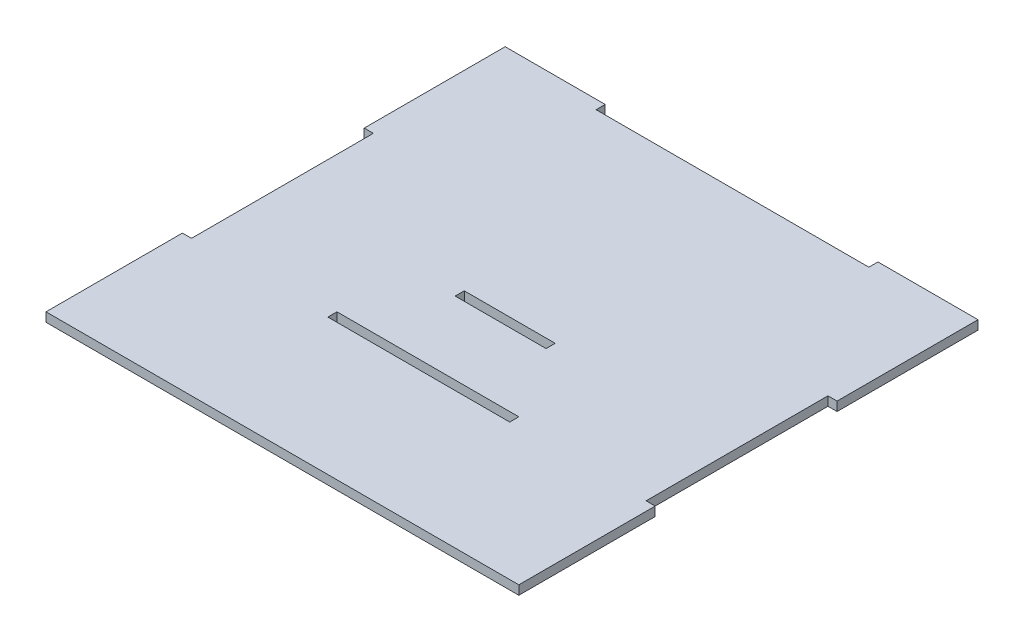
ISO-10303-21;
HEADER;
FILE_DESCRIPTION(('STEP AP214'),'2;1');
FILE_NAME('part.step','',(''),(''),'','','');
FILE_SCHEMA(('AUTOMOTIVE_DESIGN { 1 0 10303 214 1 1 1 1 }'));
ENDSEC;
DATA;
#1=APPLICATION_CONTEXT('core data for automotive mechanical design processes');
#2=APPLICATION_PROTOCOL_DEFINITION('international standard','automotive_design',2000,#1);
#3=PRODUCT_CONTEXT('',#1,'mechanical');
#4=PRODUCT('Part','Part','',(#3));
#5=PRODUCT_RELATED_PRODUCT_CATEGORY('part','',(#4));
#6=PRODUCT_DEFINITION_FORMATION('','',#4);
#7=PRODUCT_DEFINITION_CONTEXT('part definition',#1,'design');
#8=PRODUCT_DEFINITION('design','',#6,#7);
#9=PRODUCT_DEFINITION_SHAPE('','',#8);
#10=(LENGTH_UNIT() NAMED_UNIT(*) SI_UNIT(.MILLI.,.METRE.));
#11=(NAMED_UNIT(*) PLANE_ANGLE_UNIT() SI_UNIT($,.RADIAN.));
#12=(NAMED_UNIT(*) SI_UNIT($,.STERADIAN.) SOLID_ANGLE_UNIT());
#13=UNCERTAINTY_MEASURE_WITH_UNIT(LENGTH_MEASURE(1.E-05),#10,'distance_accuracy_value','');
#14=(GEOMETRIC_REPRESENTATION_CONTEXT(3) GLOBAL_UNCERTAINTY_ASSIGNED_CONTEXT((#13)) GLOBAL_UNIT_ASSIGNED_CONTEXT((#10,
#11,#12)) REPRESENTATION_CONTEXT('',''));
#15=CARTESIAN_POINT('',(0.,0.,0.));
#16=DIRECTION('',(0.,0.,1.));
#17=DIRECTION('',(1.,0.,0.));
#18=AXIS2_PLACEMENT_3D('',#15,#16,#17);
#19=CARTESIAN_POINT('',(0.,2.,-101.));
#20=DIRECTION('',(0.,0.,-1.));
#21=DIRECTION('',(-1.,0.,0.));
#22=AXIS2_PLACEMENT_3D('',#19,#20,#21);
#23=PLANE('',#22);
#24=DIRECTION('',(1.,0.,0.));
#25=VECTOR('',#24,1.);
#26=CARTESIAN_POINT('',(0.,0.,-101.));
#27=LINE('',#26,#25);
#28=CARTESIAN_POINT('',(82.,0.,-101.));
#29=VERTEX_POINT('',#28);
#30=CARTESIAN_POINT('',(104.,0.,-101.));
#31=VERTEX_POINT('',#30);
#32=EDGE_CURVE('E279',#29,#31,#27,.T.);
#33=ORIENTED_EDGE('',*,*,#32,.F.);
#34=DIRECTION('',(0.,-1.,0.));
#35=VECTOR('',#34,1.);
#36=CARTESIAN_POINT('',(82.,2.,-101.));
#37=LINE('',#36,#35);
#38=CARTESIAN_POINT('',(82.,2.,-101.));
#39=VERTEX_POINT('',#38);
#40=EDGE_CURVE('E11',#39,#29,#37,.T.);
#41=ORIENTED_EDGE('',*,*,#40,.F.);
#42=DIRECTION('',(1.,0.,0.));
#43=VECTOR('',#42,1.);
#44=CARTESIAN_POINT('',(0.,2.,-101.));
#45=LINE('',#44,#43);
#46=CARTESIAN_POINT('',(104.,2.,-101.));
#47=VERTEX_POINT('',#46);
#48=EDGE_CURVE('E434',#39,#47,#45,.T.);
#49=ORIENTED_EDGE('',*,*,#48,.T.);
#50=DIRECTION('',(0.,-1.,0.));
#51=VECTOR('',#50,1.);
#52=CARTESIAN_POINT('',(104.,2.,-101.));
#53=LINE('',#52,#51);
#54=EDGE_CURVE('E148',#47,#31,#53,.T.);
#55=ORIENTED_EDGE('',*,*,#54,.T.);
#56=EDGE_LOOP('',(#33,#41,#49,#55));
#57=FACE_BOUND('',#56,.T.);
#58=ADVANCED_FACE('F45',(#57),#23,.T.);
#59=CARTESIAN_POINT('',(82.,2.,0.));
#60=DIRECTION('',(1.,0.,0.));
#61=DIRECTION('',(0.,0.,-1.));
#62=AXIS2_PLACEMENT_3D('',#59,#60,#61);
#63=PLANE('',#62);
#64=DIRECTION('',(0.,0.,1.));
#65=VECTOR('',#64,1.);
#66=CARTESIAN_POINT('',(82.,0.,0.));
#67=LINE('',#66,#65);
#68=CARTESIAN_POINT('',(82.,0.,-99.));
#69=VERTEX_POINT('',#68);
#70=EDGE_CURVE('E282',#29,#69,#67,.T.);
#71=ORIENTED_EDGE('',*,*,#70,.T.);
#72=DIRECTION('',(0.,-1.,0.));
#73=VECTOR('',#72,1.);
#74=CARTESIAN_POINT('',(82.,2.,-99.));
#75=LINE('',#74,#73);
#76=CARTESIAN_POINT('',(82.,2.,-99.));
#77=VERTEX_POINT('',#76);
#78=EDGE_CURVE('E56',#77,#69,#75,.T.);
#79=ORIENTED_EDGE('',*,*,#78,.F.);
#80=DIRECTION('',(0.,0.,1.));
#81=VECTOR('',#80,1.);
#82=CARTESIAN_POINT('',(82.,2.,0.));
#83=LINE('',#82,#81);
#84=EDGE_CURVE('E437',#39,#77,#83,.T.);
#85=ORIENTED_EDGE('',*,*,#84,.F.);
#86=ORIENTED_EDGE('',*,*,#40,.T.);
#87=EDGE_LOOP('',(#71,#79,#85,#86));
#88=FACE_BOUND('',#87,.T.);
#89=ADVANCED_FACE('F489',(#88),#63,.F.);
#90=CARTESIAN_POINT('',(0.,2.,-99.));
#91=DIRECTION('',(0.,0.,-1.));
#92=DIRECTION('',(-1.,0.,0.));
#93=AXIS2_PLACEMENT_3D('',#90,#91,#92);
#94=PLANE('',#93);
#95=DIRECTION('',(1.,0.,0.));
#96=VECTOR('',#95,1.);
#97=CARTESIAN_POINT('',(0.,0.,-99.));
#98=LINE('',#97,#96);
#99=CARTESIAN_POINT('',(22.,0.,-99.));
#100=VERTEX_POINT('',#99);
#101=EDGE_CURVE('E287',#100,#69,#98,.T.);
#102=ORIENTED_EDGE('',*,*,#101,.F.);
#103=DIRECTION('',(0.,-1.,0.));
#104=VECTOR('',#103,1.);
#105=CARTESIAN_POINT('',(22.,2.,-99.));
#106=LINE('',#105,#104);
#107=CARTESIAN_POINT('',(22.,2.,-99.));
#108=VERTEX_POINT('',#107);
#109=EDGE_CURVE('E365',#108,#100,#106,.T.);
#110=ORIENTED_EDGE('',*,*,#109,.F.);
#111=DIRECTION('',(1.,0.,0.));
#112=VECTOR('',#111,1.);
#113=CARTESIAN_POINT('',(0.,2.,-99.));
#114=LINE('',#113,#112);
#115=EDGE_CURVE('E441',#108,#77,#114,.T.);
#116=ORIENTED_EDGE('',*,*,#115,.T.);
#117=ORIENTED_EDGE('',*,*,#78,.T.);
#118=EDGE_LOOP('',(#102,#110,#116,#117));
#119=FACE_BOUND('',#118,.T.);
#120=ADVANCED_FACE('F495',(#119),#94,.T.);
#121=CARTESIAN_POINT('',(22.,2.,0.));
#122=DIRECTION('',(1.,0.,0.));
#123=DIRECTION('',(0.,0.,-1.));
#124=AXIS2_PLACEMENT_3D('',#121,#122,#123);
#125=PLANE('',#124);
#126=DIRECTION('',(0.,0.,1.));
#127=VECTOR('',#126,1.);
#128=CARTESIAN_POINT('',(22.,0.,0.));
#129=LINE('',#128,#127);
#130=CARTESIAN_POINT('',(22.,0.,-101.));
#131=VERTEX_POINT('',#130);
#132=EDGE_CURVE('E291',#131,#100,#129,.T.);
#133=ORIENTED_EDGE('',*,*,#132,.F.);
#134=DIRECTION('',(0.,-1.,0.));
#135=VECTOR('',#134,1.);
#136=CARTESIAN_POINT('',(22.,2.,-101.));
#137=LINE('',#136,#135);
#138=CARTESIAN_POINT('',(22.,2.,-101.));
#139=VERTEX_POINT('',#138);
#140=EDGE_CURVE('E362',#139,#131,#137,.T.);
#141=ORIENTED_EDGE('',*,*,#140,.F.);
#142=DIRECTION('',(0.,0.,1.));
#143=VECTOR('',#142,1.);
#144=CARTESIAN_POINT('',(22.,2.,0.));
#145=LINE('',#144,#143);
#146=EDGE_CURVE('E445',#139,#108,#145,.T.);
#147=ORIENTED_EDGE('',*,*,#146,.T.);
#148=ORIENTED_EDGE('',*,*,#109,.T.);
#149=EDGE_LOOP('',(#133,#141,#147,#148));
#150=FACE_BOUND('',#149,.T.);
#151=ADVANCED_FACE('F502',(#150),#125,.T.);
#152=CARTESIAN_POINT('',(0.,0.,-101.));
#153=VERTEX_POINT('',#152);
#154=EDGE_CURVE('E283',#153,#131,#27,.T.);
#155=ORIENTED_EDGE('',*,*,#154,.F.);
#156=DIRECTION('',(0.,-1.,0.));
#157=VECTOR('',#156,1.);
#158=CARTESIAN_POINT('',(0.,2.,-101.));
#159=LINE('',#158,#157);
#160=CARTESIAN_POINT('',(0.,2.,-101.));
#161=VERTEX_POINT('',#160);
#162=EDGE_CURVE('E359',#161,#153,#159,.T.);
#163=ORIENTED_EDGE('',*,*,#162,.F.);
#164=EDGE_CURVE('E438',#161,#139,#45,.T.);
#165=ORIENTED_EDGE('',*,*,#164,.T.);
#166=ORIENTED_EDGE('',*,*,#140,.T.);
#167=EDGE_LOOP('',(#155,#163,#165,#166));
#168=FACE_BOUND('',#167,.T.);
#169=ADVANCED_FACE('F491',(#168),#23,.T.);
#170=CARTESIAN_POINT('',(0.,2.,0.));
#171=DIRECTION('',(-1.,0.,0.));
#172=DIRECTION('',(0.,0.,1.));
#173=AXIS2_PLACEMENT_3D('',#170,#171,#172);
#174=PLANE('',#173);
#175=DIRECTION('',(0.,0.,-1.));
#176=VECTOR('',#175,1.);
#177=CARTESIAN_POINT('',(0.,0.,0.));
#178=LINE('',#177,#176);
#179=CARTESIAN_POINT('',(0.,0.,-70.));
#180=VERTEX_POINT('',#179);
#181=EDGE_CURVE('E295',#180,#153,#178,.T.);
#182=ORIENTED_EDGE('',*,*,#181,.F.);
#183=DIRECTION('',(0.,-1.,0.));
#184=VECTOR('',#183,1.);
#185=CARTESIAN_POINT('',(0.,2.,-70.));
#186=LINE('',#185,#184);
#187=CARTESIAN_POINT('',(0.,2.,-70.));
#188=VERTEX_POINT('',#187);
#189=EDGE_CURVE('E356',#188,#180,#186,.T.);
#190=ORIENTED_EDGE('',*,*,#189,.F.);
#191=DIRECTION('',(0.,0.,-1.));
#192=VECTOR('',#191,1.);
#193=CARTESIAN_POINT('',(0.,2.,0.));
#194=LINE('',#193,#192);
#195=EDGE_CURVE('E449',#188,#161,#194,.T.);
#196=ORIENTED_EDGE('',*,*,#195,.T.);
#197=ORIENTED_EDGE('',*,*,#162,.T.);
#198=EDGE_LOOP('',(#182,#190,#196,#197));
#199=FACE_BOUND('',#198,.T.);
#200=ADVANCED_FACE('F501',(#199),#174,.T.);
#201=CARTESIAN_POINT('',(0.,2.,-70.));
#202=DIRECTION('',(0.,0.,-1.));
#203=DIRECTION('',(-1.,0.,0.));
#204=AXIS2_PLACEMENT_3D('',#201,#202,#203);
#205=PLANE('',#204);
#206=DIRECTION('',(1.,0.,0.));
#207=VECTOR('',#206,1.);
#208=CARTESIAN_POINT('',(0.,0.,-70.));
#209=LINE('',#208,#207);
#210=CARTESIAN_POINT('',(2.,0.,-70.));
#211=VERTEX_POINT('',#210);
#212=EDGE_CURVE('E299',#180,#211,#209,.T.);
#213=ORIENTED_EDGE('',*,*,#212,.T.);
#214=DIRECTION('',(0.,-1.,0.));
#215=VECTOR('',#214,1.);
#216=CARTESIAN_POINT('',(2.,2.,-70.));
#217=LINE('',#216,#215);
#218=CARTESIAN_POINT('',(2.,2.,-70.));
#219=VERTEX_POINT('',#218);
#220=EDGE_CURVE('E352',#219,#211,#217,.T.);
#221=ORIENTED_EDGE('',*,*,#220,.F.);
#222=DIRECTION('',(1.,0.,0.));
#223=VECTOR('',#222,1.);
#224=CARTESIAN_POINT('',(0.,2.,-70.));
#225=LINE('',#224,#223);
#226=EDGE_CURVE('E453',#188,#219,#225,.T.);
#227=ORIENTED_EDGE('',*,*,#226,.F.);
#228=ORIENTED_EDGE('',*,*,#189,.T.);
#229=EDGE_LOOP('',(#213,#221,#227,#228));
#230=FACE_BOUND('',#229,.T.);
#231=ADVANCED_FACE('F508',(#230),#205,.F.);
#232=CARTESIAN_POINT('',(2.,2.,0.));
#233=DIRECTION('',(1.,0.,0.));
#234=DIRECTION('',(0.,0.,-1.));
#235=AXIS2_PLACEMENT_3D('',#232,#233,#234);
#236=PLANE('',#235);
#237=DIRECTION('',(0.,0.,1.));
#238=VECTOR('',#237,1.);
#239=CARTESIAN_POINT('',(2.,0.,0.));
#240=LINE('',#239,#238);
#241=CARTESIAN_POINT('',(2.,0.,-30.));
#242=VERTEX_POINT('',#241);
#243=EDGE_CURVE('E304',#211,#242,#240,.T.);
#244=ORIENTED_EDGE('',*,*,#243,.T.);
#245=DIRECTION('',(0.,-1.,0.));
#246=VECTOR('',#245,1.);
#247=CARTESIAN_POINT('',(2.,2.,-30.));
#248=LINE('',#247,#246);
#249=CARTESIAN_POINT('',(2.,2.,-30.));
#250=VERTEX_POINT('',#249);
#251=EDGE_CURVE('E349',#250,#242,#248,.T.);
#252=ORIENTED_EDGE('',*,*,#251,.F.);
#253=DIRECTION('',(0.,0.,1.));
#254=VECTOR('',#253,1.);
#255=CARTESIAN_POINT('',(2.,2.,0.));
#256=LINE('',#255,#254);
#257=EDGE_CURVE('E458',#219,#250,#256,.T.);
#258=ORIENTED_EDGE('',*,*,#257,.F.);
#259=ORIENTED_EDGE('',*,*,#220,.T.);
#260=EDGE_LOOP('',(#244,#252,#258,#259));
#261=FACE_BOUND('',#260,.T.);
#262=ADVANCED_FACE('F621',(#261),#236,.F.);
#263=CARTESIAN_POINT('',(0.,2.,-30.));
#264=DIRECTION('',(0.,0.,-1.));
#265=DIRECTION('',(-1.,0.,0.));
#266=AXIS2_PLACEMENT_3D('',#263,#264,#265);
#267=PLANE('',#266);
#268=DIRECTION('',(1.,0.,0.));
#269=VECTOR('',#268,1.);
#270=CARTESIAN_POINT('',(0.,0.,-30.));
#271=LINE('',#270,#269);
#272=CARTESIAN_POINT('',(0.,0.,-30.));
#273=VERTEX_POINT('',#272);
#274=EDGE_CURVE('E308',#273,#242,#271,.T.);
#275=ORIENTED_EDGE('',*,*,#274,.F.);
#276=DIRECTION('',(0.,-1.,0.));
#277=VECTOR('',#276,1.);
#278=CARTESIAN_POINT('',(0.,2.,-30.));
#279=LINE('',#278,#277);
#280=CARTESIAN_POINT('',(0.,2.,-30.));
#281=VERTEX_POINT('',#280);
#282=EDGE_CURVE('E346',#281,#273,#279,.T.);
#283=ORIENTED_EDGE('',*,*,#282,.F.);
#284=DIRECTION('',(1.,0.,0.));
#285=VECTOR('',#284,1.);
#286=CARTESIAN_POINT('',(0.,2.,-30.));
#287=LINE('',#286,#285);
#288=EDGE_CURVE('E461',#281,#250,#287,.T.);
#289=ORIENTED_EDGE('',*,*,#288,.T.);
#290=ORIENTED_EDGE('',*,*,#251,.T.);
#291=EDGE_LOOP('',(#275,#283,#289,#290));
#292=FACE_BOUND('',#291,.T.);
#293=ADVANCED_FACE('F535',(#292),#267,.T.);
#294=CARTESIAN_POINT('',(0.,0.,0.));
#295=VERTEX_POINT('',#294);
#296=EDGE_CURVE('E300',#295,#273,#178,.T.);
#297=ORIENTED_EDGE('',*,*,#296,.F.);
#298=DIRECTION('',(0.,-1.,0.));
#299=VECTOR('',#298,1.);
#300=CARTESIAN_POINT('',(0.,2.,0.));
#301=LINE('',#300,#299);
#302=CARTESIAN_POINT('',(0.,2.,0.));
#303=VERTEX_POINT('',#302);
#304=EDGE_CURVE('E343',#303,#295,#301,.T.);
#305=ORIENTED_EDGE('',*,*,#304,.F.);
#306=EDGE_CURVE('E454',#303,#281,#194,.T.);
#307=ORIENTED_EDGE('',*,*,#306,.T.);
#308=ORIENTED_EDGE('',*,*,#282,.T.);
#309=EDGE_LOOP('',(#297,#305,#307,#308));
#310=FACE_BOUND('',#309,.T.);
#311=ADVANCED_FACE('F511',(#310),#174,.T.);
#312=CARTESIAN_POINT('',(0.,2.,0.));
#313=DIRECTION('',(0.,0.,-1.));
#314=DIRECTION('',(-1.,0.,0.));
#315=AXIS2_PLACEMENT_3D('',#312,#313,#314);
#316=PLANE('',#315);
#317=DIRECTION('',(1.,0.,0.));
#318=VECTOR('',#317,1.);
#319=CARTESIAN_POINT('',(0.,0.,0.));
#320=LINE('',#319,#318);
#321=CARTESIAN_POINT('',(104.,0.,0.));
#322=VERTEX_POINT('',#321);
#323=EDGE_CURVE('E312',#295,#322,#320,.T.);
#324=ORIENTED_EDGE('',*,*,#323,.T.);
#325=DIRECTION('',(0.,-1.,0.));
#326=VECTOR('',#325,1.);
#327=CARTESIAN_POINT('',(104.,2.,0.));
#328=LINE('',#327,#326);
#329=CARTESIAN_POINT('',(104.,2.,0.));
#330=VERTEX_POINT('',#329);
#331=EDGE_CURVE('E339',#330,#322,#328,.T.);
#332=ORIENTED_EDGE('',*,*,#331,.F.);
#333=DIRECTION('',(1.,0.,0.));
#334=VECTOR('',#333,1.);
#335=CARTESIAN_POINT('',(0.,2.,0.));
#336=LINE('',#335,#334);
#337=EDGE_CURVE('E465',#303,#330,#336,.T.);
#338=ORIENTED_EDGE('',*,*,#337,.F.);
#339=ORIENTED_EDGE('',*,*,#304,.T.);
#340=EDGE_LOOP('',(#324,#332,#338,#339));
#341=FACE_BOUND('',#340,.T.);
#342=ADVANCED_FACE('F650',(#341),#316,.F.);
#343=CARTESIAN_POINT('',(104.,2.,0.));
#344=DIRECTION('',(-1.,0.,0.));
#345=DIRECTION('',(0.,0.,1.));
#346=AXIS2_PLACEMENT_3D('',#343,#344,#345);
#347=PLANE('',#346);
#348=DIRECTION('',(0.,0.,-1.));
#349=VECTOR('',#348,1.);
#350=CARTESIAN_POINT('',(104.,0.,0.));
#351=LINE('',#350,#349);
#352=CARTESIAN_POINT('',(104.,0.,-30.));
#353=VERTEX_POINT('',#352);
#354=EDGE_CURVE('E316',#322,#353,#351,.T.);
#355=ORIENTED_EDGE('',*,*,#354,.T.);
#356=DIRECTION('',(0.,-1.,0.));
#357=VECTOR('',#356,1.);
#358=CARTESIAN_POINT('',(104.,2.,-30.));
#359=LINE('',#358,#357);
#360=CARTESIAN_POINT('',(104.,2.,-30.));
#361=VERTEX_POINT('',#360);
#362=EDGE_CURVE('E336',#361,#353,#359,.T.);
#363=ORIENTED_EDGE('',*,*,#362,.F.);
#364=DIRECTION('',(0.,0.,-1.));
#365=VECTOR('',#364,1.);
#366=CARTESIAN_POINT('',(104.,2.,0.));
#367=LINE('',#366,#365);
#368=EDGE_CURVE('E244',#330,#361,#367,.T.);
#369=ORIENTED_EDGE('',*,*,#368,.F.);
#370=ORIENTED_EDGE('',*,*,#331,.T.);
#371=EDGE_LOOP('',(#355,#363,#369,#370));
#372=FACE_BOUND('',#371,.T.);
#373=ADVANCED_FACE('F475',(#372),#347,.F.);
#374=CARTESIAN_POINT('',(0.,2.,-30.));
#375=DIRECTION('',(0.,0.,-1.));
#376=DIRECTION('',(-1.,0.,0.));
#377=AXIS2_PLACEMENT_3D('',#374,#375,#376);
#378=PLANE('',#377);
#379=DIRECTION('',(1.,0.,0.));
#380=VECTOR('',#379,1.);
#381=CARTESIAN_POINT('',(0.,0.,-30.));
#382=LINE('',#381,#380);
#383=CARTESIAN_POINT('',(102.,0.,-30.));
#384=VERTEX_POINT('',#383);
#385=EDGE_CURVE('E320',#384,#353,#382,.T.);
#386=ORIENTED_EDGE('',*,*,#385,.F.);
#387=DIRECTION('',(0.,-1.,0.));
#388=VECTOR('',#387,1.);
#389=CARTESIAN_POINT('',(102.,2.,-30.));
#390=LINE('',#389,#388);
#391=CARTESIAN_POINT('',(102.,2.,-30.));
#392=VERTEX_POINT('',#391);
#393=EDGE_CURVE('E229',#392,#384,#390,.T.);
#394=ORIENTED_EDGE('',*,*,#393,.F.);
#395=DIRECTION('',(1.,0.,0.));
#396=VECTOR('',#395,1.);
#397=CARTESIAN_POINT('',(0.,2.,-30.));
#398=LINE('',#397,#396);
#399=EDGE_CURVE('E240',#392,#361,#398,.T.);
#400=ORIENTED_EDGE('',*,*,#399,.T.);
#401=ORIENTED_EDGE('',*,*,#362,.T.);
#402=EDGE_LOOP('',(#386,#394,#400,#401));
#403=FACE_BOUND('',#402,.T.);
#404=ADVANCED_FACE('F478',(#403),#378,.T.);
#405=CARTESIAN_POINT('',(102.,2.,0.));
#406=DIRECTION('',(1.,0.,0.));
#407=DIRECTION('',(0.,0.,-1.));
#408=AXIS2_PLACEMENT_3D('',#405,#406,#407);
#409=PLANE('',#408);
#410=DIRECTION('',(0.,0.,1.));
#411=VECTOR('',#410,1.);
#412=CARTESIAN_POINT('',(102.,0.,0.));
#413=LINE('',#412,#411);
#414=CARTESIAN_POINT('',(102.,0.,-70.));
#415=VERTEX_POINT('',#414);
#416=EDGE_CURVE('E225',#415,#384,#413,.T.);
#417=ORIENTED_EDGE('',*,*,#416,.F.);
#418=DIRECTION('',(0.,-1.,0.));
#419=VECTOR('',#418,1.);
#420=CARTESIAN_POINT('',(102.,2.,-70.));
#421=LINE('',#420,#419);
#422=CARTESIAN_POINT('',(102.,2.,-70.));
#423=VERTEX_POINT('',#422);
#424=EDGE_CURVE('E219',#423,#415,#421,.T.);
#425=ORIENTED_EDGE('',*,*,#424,.F.);
#426=DIRECTION('',(0.,0.,1.));
#427=VECTOR('',#426,1.);
#428=CARTESIAN_POINT('',(102.,2.,0.));
#429=LINE('',#428,#427);
#430=EDGE_CURVE('E223',#423,#392,#429,.T.);
#431=ORIENTED_EDGE('',*,*,#430,.T.);
#432=ORIENTED_EDGE('',*,*,#393,.T.);
#433=EDGE_LOOP('',(#417,#425,#431,#432));
#434=FACE_BOUND('',#433,.T.);
#435=ADVANCED_FACE('F221',(#434),#409,.T.);
#436=CARTESIAN_POINT('',(0.,2.,-70.));
#437=DIRECTION('',(0.,0.,-1.));
#438=DIRECTION('',(-1.,0.,0.));
#439=AXIS2_PLACEMENT_3D('',#436,#437,#438);
#440=PLANE('',#439);
#441=DIRECTION('',(1.,0.,0.));
#442=VECTOR('',#441,1.);
#443=CARTESIAN_POINT('',(0.,0.,-70.));
#444=LINE('',#443,#442);
#445=CARTESIAN_POINT('',(104.,0.,-70.));
#446=VERTEX_POINT('',#445);
#447=EDGE_CURVE('E326',#415,#446,#444,.T.);
#448=ORIENTED_EDGE('',*,*,#447,.T.);
#449=DIRECTION('',(0.,-1.,0.));
#450=VECTOR('',#449,1.);
#451=CARTESIAN_POINT('',(104.,2.,-70.));
#452=LINE('',#451,#450);
#453=CARTESIAN_POINT('',(104.,2.,-70.));
#454=VERTEX_POINT('',#453);
#455=EDGE_CURVE('E230',#454,#446,#452,.T.);
#456=ORIENTED_EDGE('',*,*,#455,.F.);
#457=DIRECTION('',(1.,0.,0.));
#458=VECTOR('',#457,1.);
#459=CARTESIAN_POINT('',(0.,2.,-70.));
#460=LINE('',#459,#458);
#461=EDGE_CURVE('E233',#423,#454,#460,.T.);
#462=ORIENTED_EDGE('',*,*,#461,.F.);
#463=ORIENTED_EDGE('',*,*,#424,.T.);
#464=EDGE_LOOP('',(#448,#456,#462,#463));
#465=FACE_BOUND('',#464,.T.);
#466=ADVANCED_FACE('F234',(#465),#440,.F.);
#467=CARTESIAN_POINT('',(62.,2.,0.));
#468=DIRECTION('',(-1.,0.,0.));
#469=DIRECTION('',(0.,0.,1.));
#470=AXIS2_PLACEMENT_3D('',#467,#468,#469);
#471=PLANE('',#470);
#472=DIRECTION('',(0.,0.,-1.));
#473=VECTOR('',#472,1.);
#474=CARTESIAN_POINT('',(62.,0.,0.));
#475=LINE('',#474,#473);
#476=CARTESIAN_POINT('',(62.,0.,-48.));
#477=VERTEX_POINT('',#476);
#478=CARTESIAN_POINT('',(62.,0.,-50.));
#479=VERTEX_POINT('',#478);
#480=EDGE_CURVE('E263',#477,#479,#475,.T.);
#481=ORIENTED_EDGE('',*,*,#480,.F.);
#482=DIRECTION('',(0.,-1.,0.));
#483=VECTOR('',#482,1.);
#484=CARTESIAN_POINT('',(62.,2.,-48.));
#485=LINE('',#484,#483);
#486=CARTESIAN_POINT('',(62.,2.,-48.));
#487=VERTEX_POINT('',#486);
#488=EDGE_CURVE('E331',#487,#477,#485,.T.);
#489=ORIENTED_EDGE('',*,*,#488,.F.);
#490=DIRECTION('',(0.,0.,-1.));
#491=VECTOR('',#490,1.);
#492=CARTESIAN_POINT('',(62.,2.,0.));
#493=LINE('',#492,#491);
#494=CARTESIAN_POINT('',(62.,2.,-50.));
#495=VERTEX_POINT('',#494);
#496=EDGE_CURVE('E413',#487,#495,#493,.T.);
#497=ORIENTED_EDGE('',*,*,#496,.T.);
#498=DIRECTION('',(0.,-1.,0.));
#499=VECTOR('',#498,1.);
#500=CARTESIAN_POINT('',(62.,2.,-50.));
#501=LINE('',#500,#499);
#502=EDGE_CURVE('E370',#495,#479,#501,.T.);
#503=ORIENTED_EDGE('',*,*,#502,.T.);
#504=EDGE_LOOP('',(#481,#489,#497,#503));
#505=FACE_BOUND('',#504,.T.);
#506=ADVANCED_FACE('F560',(#505),#471,.T.);
#507=CARTESIAN_POINT('',(0.,2.,-48.));
#508=DIRECTION('',(0.,0.,-1.));
#509=DIRECTION('',(-1.,0.,0.));
#510=AXIS2_PLACEMENT_3D('',#507,#508,#509);
#511=PLANE('',#510);
#512=DIRECTION('',(1.,0.,0.));
#513=VECTOR('',#512,1.);
#514=CARTESIAN_POINT('',(0.,0.,-48.));
#515=LINE('',#514,#513);
#516=CARTESIAN_POINT('',(42.,0.,-48.));
#517=VERTEX_POINT('',#516);
#518=EDGE_CURVE('E267',#517,#477,#515,.T.);
#519=ORIENTED_EDGE('',*,*,#518,.F.);
#520=DIRECTION('',(0.,-1.,0.));
#521=VECTOR('',#520,1.);
#522=CARTESIAN_POINT('',(42.,2.,-48.));
#523=LINE('',#522,#521);
#524=CARTESIAN_POINT('',(42.,2.,-48.));
#525=VERTEX_POINT('',#524);
#526=EDGE_CURVE('E377',#525,#517,#523,.T.);
#527=ORIENTED_EDGE('',*,*,#526,.F.);
#528=DIRECTION('',(1.,0.,0.));
#529=VECTOR('',#528,1.);
#530=CARTESIAN_POINT('',(0.,2.,-48.));
#531=LINE('',#530,#529);
#532=EDGE_CURVE('E419',#525,#487,#531,.T.);
#533=ORIENTED_EDGE('',*,*,#532,.T.);
#534=ORIENTED_EDGE('',*,*,#488,.T.);
#535=EDGE_LOOP('',(#519,#527,#533,#534));
#536=FACE_BOUND('',#535,.T.);
#537=ADVANCED_FACE('F551',(#536),#511,.T.);
#538=CARTESIAN_POINT('',(42.,2.,0.));
#539=DIRECTION('',(-1.,0.,0.));
#540=DIRECTION('',(0.,0.,1.));
#541=AXIS2_PLACEMENT_3D('',#538,#539,#540);
#542=PLANE('',#541);
#543=DIRECTION('',(0.,0.,-1.));
#544=VECTOR('',#543,1.);
#545=CARTESIAN_POINT('',(42.,0.,0.));
#546=LINE('',#545,#544);
#547=CARTESIAN_POINT('',(42.,0.,-50.));
#548=VERTEX_POINT('',#547);
#549=EDGE_CURVE('E271',#517,#548,#546,.T.);
#550=ORIENTED_EDGE('',*,*,#549,.T.);
#551=DIRECTION('',(0.,-1.,0.));
#552=VECTOR('',#551,1.);
#553=CARTESIAN_POINT('',(42.,2.,-50.));
#554=LINE('',#553,#552);
#555=CARTESIAN_POINT('',(42.,2.,-50.));
#556=VERTEX_POINT('',#555);
#557=EDGE_CURVE('E373',#556,#548,#554,.T.);
#558=ORIENTED_EDGE('',*,*,#557,.F.);
#559=DIRECTION('',(0.,0.,-1.));
#560=VECTOR('',#559,1.);
#561=CARTESIAN_POINT('',(42.,2.,0.));
#562=LINE('',#561,#560);
#563=EDGE_CURVE('E427',#525,#556,#562,.T.);
#564=ORIENTED_EDGE('',*,*,#563,.F.);
#565=ORIENTED_EDGE('',*,*,#526,.T.);
#566=EDGE_LOOP('',(#550,#558,#564,#565));
#567=FACE_BOUND('',#566,.T.);
#568=ADVANCED_FACE('F557',(#567),#542,.F.);
#569=CARTESIAN_POINT('',(72.,2.,0.));
#570=DIRECTION('',(-1.,0.,0.));
#571=DIRECTION('',(0.,0.,1.));
#572=AXIS2_PLACEMENT_3D('',#569,#570,#571);
#573=PLANE('',#572);
#574=DIRECTION('',(0.,0.,-1.));
#575=VECTOR('',#574,1.);
#576=CARTESIAN_POINT('',(72.,0.,0.));
#577=LINE('',#576,#575);
#578=CARTESIAN_POINT('',(72.,0.,-30.));
#579=VERTEX_POINT('',#578);
#580=CARTESIAN_POINT('',(72.,0.,-32.));
#581=VERTEX_POINT('',#580);
#582=EDGE_CURVE('E248',#579,#581,#577,.T.);
#583=ORIENTED_EDGE('',*,*,#582,.F.);
#584=DIRECTION('',(0.,-1.,0.));
#585=VECTOR('',#584,1.);
#586=CARTESIAN_POINT('',(72.,2.,-30.));
#587=LINE('',#586,#585);
#588=CARTESIAN_POINT('',(72.,2.,-30.));
#589=VERTEX_POINT('',#588);
#590=EDGE_CURVE('E49',#589,#579,#587,.T.);
#591=ORIENTED_EDGE('',*,*,#590,.F.);
#592=DIRECTION('',(0.,0.,-1.));
#593=VECTOR('',#592,1.);
#594=CARTESIAN_POINT('',(72.,2.,0.));
#595=LINE('',#594,#593);
#596=CARTESIAN_POINT('',(72.,2.,-32.));
#597=VERTEX_POINT('',#596);
#598=EDGE_CURVE('E541',#589,#597,#595,.T.);
#599=ORIENTED_EDGE('',*,*,#598,.T.);
#600=DIRECTION('',(0.,-1.,0.));
#601=VECTOR('',#600,1.);
#602=CARTESIAN_POINT('',(72.,2.,-32.));
#603=LINE('',#602,#601);
#604=EDGE_CURVE('E382',#597,#581,#603,.T.);
#605=ORIENTED_EDGE('',*,*,#604,.T.);
#606=EDGE_LOOP('',(#583,#591,#599,#605));
#607=FACE_BOUND('',#606,.T.);
#608=ADVANCED_FACE('F47',(#607),#573,.T.);
#609=CARTESIAN_POINT('',(0.,2.,-30.));
#610=DIRECTION('',(0.,0.,-1.));
#611=DIRECTION('',(-1.,0.,0.));
#612=AXIS2_PLACEMENT_3D('',#609,#610,#611);
#613=PLANE('',#612);
#614=DIRECTION('',(1.,0.,0.));
#615=VECTOR('',#614,1.);
#616=CARTESIAN_POINT('',(0.,0.,-30.));
#617=LINE('',#616,#615);
#618=CARTESIAN_POINT('',(32.,0.,-30.));
#619=VERTEX_POINT('',#618);
#620=EDGE_CURVE('E252',#619,#579,#617,.T.);
#621=ORIENTED_EDGE('',*,*,#620,.F.);
#622=DIRECTION('',(0.,-1.,0.));
#623=VECTOR('',#622,1.);
#624=CARTESIAN_POINT('',(32.,2.,-30.));
#625=LINE('',#624,#623);
#626=CARTESIAN_POINT('',(32.,2.,-30.));
#627=VERTEX_POINT('',#626);
#628=EDGE_CURVE('E388',#627,#619,#625,.T.);
#629=ORIENTED_EDGE('',*,*,#628,.F.);
#630=DIRECTION('',(1.,0.,0.));
#631=VECTOR('',#630,1.);
#632=CARTESIAN_POINT('',(0.,2.,-30.));
#633=LINE('',#632,#631);
#634=EDGE_CURVE('E399',#627,#589,#633,.T.);
#635=ORIENTED_EDGE('',*,*,#634,.T.);
#636=ORIENTED_EDGE('',*,*,#590,.T.);
#637=EDGE_LOOP('',(#621,#629,#635,#636));
#638=FACE_BOUND('',#637,.T.);
#639=ADVANCED_FACE('F397',(#638),#613,.T.);
#640=CARTESIAN_POINT('',(32.,2.,0.));
#641=DIRECTION('',(-1.,0.,0.));
#642=DIRECTION('',(0.,0.,1.));
#643=AXIS2_PLACEMENT_3D('',#640,#641,#642);
#644=PLANE('',#643);
#645=DIRECTION('',(0.,0.,-1.));
#646=VECTOR('',#645,1.);
#647=CARTESIAN_POINT('',(32.,0.,0.));
#648=LINE('',#647,#646);
#649=CARTESIAN_POINT('',(32.,0.,-32.));
#650=VERTEX_POINT('',#649);
#651=EDGE_CURVE('E256',#619,#650,#648,.T.);
#652=ORIENTED_EDGE('',*,*,#651,.T.);
#653=DIRECTION('',(0.,-1.,0.));
#654=VECTOR('',#653,1.);
#655=CARTESIAN_POINT('',(32.,2.,-32.));
#656=LINE('',#655,#654);
#657=CARTESIAN_POINT('',(32.,2.,-32.));
#658=VERTEX_POINT('',#657);
#659=EDGE_CURVE('E385',#658,#650,#656,.T.);
#660=ORIENTED_EDGE('',*,*,#659,.F.);
#661=DIRECTION('',(0.,0.,-1.));
#662=VECTOR('',#661,1.);
#663=CARTESIAN_POINT('',(32.,2.,0.));
#664=LINE('',#663,#662);
#665=EDGE_CURVE('E414',#627,#658,#664,.T.);
#666=ORIENTED_EDGE('',*,*,#665,.F.);
#667=ORIENTED_EDGE('',*,*,#628,.T.);
#668=EDGE_LOOP('',(#652,#660,#666,#667));
#669=FACE_BOUND('',#668,.T.);
#670=ADVANCED_FACE('F406',(#669),#644,.F.);
#671=CARTESIAN_POINT('',(0.,2.,-50.));
#672=DIRECTION('',(0.,0.,-1.));
#673=DIRECTION('',(-1.,0.,0.));
#674=AXIS2_PLACEMENT_3D('',#671,#672,#673);
#675=PLANE('',#674);
#676=DIRECTION('',(1.,0.,0.));
#677=VECTOR('',#676,1.);
#678=CARTESIAN_POINT('',(0.,0.,-50.));
#679=LINE('',#678,#677);
#680=EDGE_CURVE('E275',#548,#479,#679,.T.);
#681=ORIENTED_EDGE('',*,*,#680,.T.);
#682=ORIENTED_EDGE('',*,*,#502,.F.);
#683=DIRECTION('',(1.,0.,0.));
#684=VECTOR('',#683,1.);
#685=CARTESIAN_POINT('',(0.,2.,-50.));
#686=LINE('',#685,#684);
#687=EDGE_CURVE('E431',#556,#495,#686,.T.);
#688=ORIENTED_EDGE('',*,*,#687,.F.);
#689=ORIENTED_EDGE('',*,*,#557,.T.);
#690=EDGE_LOOP('',(#681,#682,#688,#689));
#691=FACE_BOUND('',#690,.T.);
#692=ADVANCED_FACE('F559',(#691),#675,.F.);
#693=CARTESIAN_POINT('',(0.,2.,-32.));
#694=DIRECTION('',(0.,0.,-1.));
#695=DIRECTION('',(-1.,0.,0.));
#696=AXIS2_PLACEMENT_3D('',#693,#694,#695);
#697=PLANE('',#696);
#698=DIRECTION('',(1.,0.,0.));
#699=VECTOR('',#698,1.);
#700=CARTESIAN_POINT('',(0.,0.,-32.));
#701=LINE('',#700,#699);
#702=EDGE_CURVE('E259',#650,#581,#701,.T.);
#703=ORIENTED_EDGE('',*,*,#702,.T.);
#704=ORIENTED_EDGE('',*,*,#604,.F.);
#705=DIRECTION('',(1.,0.,0.));
#706=VECTOR('',#705,1.);
#707=CARTESIAN_POINT('',(0.,2.,-32.));
#708=LINE('',#707,#706);
#709=EDGE_CURVE('E410',#658,#597,#708,.T.);
#710=ORIENTED_EDGE('',*,*,#709,.F.);
#711=ORIENTED_EDGE('',*,*,#659,.T.);
#712=EDGE_LOOP('',(#703,#704,#710,#711));
#713=FACE_BOUND('',#712,.T.);
#714=ADVANCED_FACE('F409',(#713),#697,.F.);
#715=EDGE_CURVE('E141',#446,#31,#351,.T.);
#716=ORIENTED_EDGE('',*,*,#715,.T.);
#717=ORIENTED_EDGE('',*,*,#54,.F.);
#718=EDGE_CURVE('E65',#454,#47,#367,.T.);
#719=ORIENTED_EDGE('',*,*,#718,.F.);
#720=ORIENTED_EDGE('',*,*,#455,.T.);
#721=EDGE_LOOP('',(#716,#717,#719,#720));
#722=FACE_BOUND('',#721,.T.);
#723=ADVANCED_FACE('F485',(#722),#347,.F.);
#724=CARTESIAN_POINT('',(0.,2.,0.));
#725=DIRECTION('',(0.,1.,0.));
#726=DIRECTION('',(0.,0.,1.));
#727=AXIS2_PLACEMENT_3D('',#724,#725,#726);
#728=PLANE('',#727);
#729=ORIENTED_EDGE('',*,*,#598,.F.);
#730=ORIENTED_EDGE('',*,*,#634,.F.);
#731=ORIENTED_EDGE('',*,*,#665,.T.);
#732=ORIENTED_EDGE('',*,*,#709,.T.);
#733=EDGE_LOOP('',(#729,#730,#731,#732));
#734=FACE_BOUND('',#733,.T.);
#735=ORIENTED_EDGE('',*,*,#496,.F.);
#736=ORIENTED_EDGE('',*,*,#532,.F.);
#737=ORIENTED_EDGE('',*,*,#563,.T.);
#738=ORIENTED_EDGE('',*,*,#687,.T.);
#739=EDGE_LOOP('',(#735,#736,#737,#738));
#740=FACE_BOUND('',#739,.T.);
#741=ORIENTED_EDGE('',*,*,#48,.F.);
#742=ORIENTED_EDGE('',*,*,#84,.T.);
#743=ORIENTED_EDGE('',*,*,#115,.F.);
#744=ORIENTED_EDGE('',*,*,#146,.F.);
#745=ORIENTED_EDGE('',*,*,#164,.F.);
#746=ORIENTED_EDGE('',*,*,#195,.F.);
#747=ORIENTED_EDGE('',*,*,#226,.T.);
#748=ORIENTED_EDGE('',*,*,#257,.T.);
#749=ORIENTED_EDGE('',*,*,#288,.F.);
#750=ORIENTED_EDGE('',*,*,#306,.F.);
#751=ORIENTED_EDGE('',*,*,#337,.T.);
#752=ORIENTED_EDGE('',*,*,#368,.T.);
#753=ORIENTED_EDGE('',*,*,#399,.F.);
#754=ORIENTED_EDGE('',*,*,#430,.F.);
#755=ORIENTED_EDGE('',*,*,#461,.T.);
#756=ORIENTED_EDGE('',*,*,#718,.T.);
#757=EDGE_LOOP('',(#741,#742,#743,#744,#745,#746,#747,#748,#749,#750,#751,#752,#753,#754,#755,#756));
#758=FACE_BOUND('',#757,.T.);
#759=ADVANCED_FACE('F238',(#734,#740,#758),#728,.T.);
#760=CARTESIAN_POINT('',(0.,0.,0.));
#761=DIRECTION('',(0.,1.,0.));
#762=DIRECTION('',(0.,0.,1.));
#763=AXIS2_PLACEMENT_3D('',#760,#761,#762);
#764=PLANE('',#763);
#765=ORIENTED_EDGE('',*,*,#582,.T.);
#766=ORIENTED_EDGE('',*,*,#702,.F.);
#767=ORIENTED_EDGE('',*,*,#651,.F.);
#768=ORIENTED_EDGE('',*,*,#620,.T.);
#769=EDGE_LOOP('',(#765,#766,#767,#768));
#770=FACE_BOUND('',#769,.T.);
#771=ORIENTED_EDGE('',*,*,#480,.T.);
#772=ORIENTED_EDGE('',*,*,#680,.F.);
#773=ORIENTED_EDGE('',*,*,#549,.F.);
#774=ORIENTED_EDGE('',*,*,#518,.T.);
#775=EDGE_LOOP('',(#771,#772,#773,#774));
#776=FACE_BOUND('',#775,.T.);
#777=ORIENTED_EDGE('',*,*,#32,.T.);
#778=ORIENTED_EDGE('',*,*,#715,.F.);
#779=ORIENTED_EDGE('',*,*,#447,.F.);
#780=ORIENTED_EDGE('',*,*,#416,.T.);
#781=ORIENTED_EDGE('',*,*,#385,.T.);
#782=ORIENTED_EDGE('',*,*,#354,.F.);
#783=ORIENTED_EDGE('',*,*,#323,.F.);
#784=ORIENTED_EDGE('',*,*,#296,.T.);
#785=ORIENTED_EDGE('',*,*,#274,.T.);
#786=ORIENTED_EDGE('',*,*,#243,.F.);
#787=ORIENTED_EDGE('',*,*,#212,.F.);
#788=ORIENTED_EDGE('',*,*,#181,.T.);
#789=ORIENTED_EDGE('',*,*,#154,.T.);
#790=ORIENTED_EDGE('',*,*,#132,.T.);
#791=ORIENTED_EDGE('',*,*,#101,.T.);
#792=ORIENTED_EDGE('',*,*,#70,.F.);
#793=EDGE_LOOP('',(#777,#778,#779,#780,#781,#782,#783,#784,#785,#786,#787,#788,#789,#790,#791,#792));
#794=FACE_BOUND('',#793,.T.);
#795=ADVANCED_FACE('F403',(#770,#776,#794),#764,.F.);
#796=CLOSED_SHELL('',(#58,#89,#120,#151,#169,#200,#231,#262,#293,#311,#342,#373,#404,#435,#466,
#506,#537,#568,#608,#639,#670,#692,#714,#723,#759,#795));
#797=MANIFOLD_SOLID_BREP('B2',#796);
#798=ADVANCED_BREP_SHAPE_REPRESENTATION('',(#18,#797),#14);
#799=SHAPE_DEFINITION_REPRESENTATION(#9,#798);
ENDSEC;
END-ISO-10303-21;
